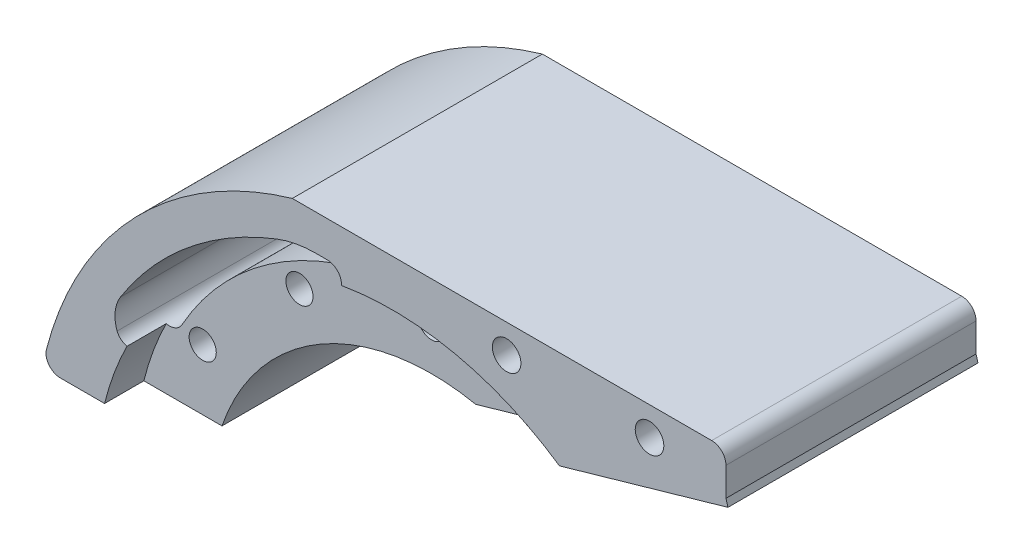
ISO-10303-21;
HEADER;
FILE_DESCRIPTION(('STEP AP214'),'2;1');
FILE_NAME('part.step','',(''),(''),'','','');
FILE_SCHEMA(('AUTOMOTIVE_DESIGN { 1 0 10303 214 1 1 1 1 }'));
ENDSEC;
DATA;
#1=APPLICATION_CONTEXT('core data for automotive mechanical design processes');
#2=APPLICATION_PROTOCOL_DEFINITION('international standard','automotive_design',2000,#1);
#3=PRODUCT_CONTEXT('',#1,'mechanical');
#4=PRODUCT('Part','Part','',(#3));
#5=PRODUCT_RELATED_PRODUCT_CATEGORY('part','',(#4));
#6=PRODUCT_DEFINITION_FORMATION('','',#4);
#7=PRODUCT_DEFINITION_CONTEXT('part definition',#1,'design');
#8=PRODUCT_DEFINITION('design','',#6,#7);
#9=PRODUCT_DEFINITION_SHAPE('','',#8);
#10=(LENGTH_UNIT() NAMED_UNIT(*) SI_UNIT(.MILLI.,.METRE.));
#11=(NAMED_UNIT(*) PLANE_ANGLE_UNIT() SI_UNIT($,.RADIAN.));
#12=(NAMED_UNIT(*) SI_UNIT($,.STERADIAN.) SOLID_ANGLE_UNIT());
#13=UNCERTAINTY_MEASURE_WITH_UNIT(LENGTH_MEASURE(1.E-05),#10,'distance_accuracy_value','');
#14=(GEOMETRIC_REPRESENTATION_CONTEXT(3) GLOBAL_UNCERTAINTY_ASSIGNED_CONTEXT((#13)) GLOBAL_UNIT_ASSIGNED_CONTEXT((#10,
#11,#12)) REPRESENTATION_CONTEXT('',''));
#15=CARTESIAN_POINT('',(0.,0.,0.));
#16=DIRECTION('',(0.,0.,1.));
#17=DIRECTION('',(1.,0.,0.));
#18=AXIS2_PLACEMENT_3D('',#15,#16,#17);
#19=CARTESIAN_POINT('',(46.4199727150327,26.4346966383038,35.));
#20=DIRECTION('',(-0.275637355816993,0.961261695938321,0.));
#21=DIRECTION('',(-0.961261695938321,-0.275637355816993,0.));
#22=AXIS2_PLACEMENT_3D('',#19,#20,#21);
#23=PLANE('',#22);
#24=DIRECTION('',(0.961261695938321,0.275637355816991,0.));
#25=VECTOR('',#24,1.);
#26=CARTESIAN_POINT('',(60.1747509336742,30.3788158246349,29.5));
#27=LINE('',#26,#25);
#28=CARTESIAN_POINT('',(60.1747509336742,30.3788158246349,29.5));
#29=VERTEX_POINT('',#28);
#30=CARTESIAN_POINT('',(67.0584771235376,32.3526925464053,29.5));
#31=VERTEX_POINT('',#30);
#32=EDGE_CURVE('E201',#29,#31,#27,.T.);
#33=ORIENTED_EDGE('',*,*,#32,.F.);
#34=DIRECTION('',(0.,0.,-1.));
#35=VECTOR('',#34,1.);
#36=CARTESIAN_POINT('',(60.1747509336742,30.3788158246349,35.));
#37=LINE('',#36,#35);
#38=CARTESIAN_POINT('',(60.1747509336742,30.3788158246349,0.));
#39=VERTEX_POINT('',#38);
#40=EDGE_CURVE('E197',#29,#39,#37,.T.);
#41=ORIENTED_EDGE('',*,*,#40,.T.);
#42=DIRECTION('',(0.961261695938321,0.275637355816991,0.));
#43=VECTOR('',#42,1.);
#44=CARTESIAN_POINT('',(67.0584771235376,32.3526925464053,0.));
#45=LINE('',#44,#43);
#46=CARTESIAN_POINT('',(67.0584771235376,32.3526925464053,0.));
#47=VERTEX_POINT('',#46);
#48=EDGE_CURVE('E200',#39,#47,#45,.T.);
#49=ORIENTED_EDGE('',*,*,#48,.T.);
#50=DIRECTION('',(0.,0.,1.));
#51=VECTOR('',#50,1.);
#52=CARTESIAN_POINT('',(67.0584771235376,32.3526925464053,-35.5400386676256));
#53=LINE('',#52,#51);
#54=EDGE_CURVE('E364',#47,#31,#53,.T.);
#55=ORIENTED_EDGE('',*,*,#54,.T.);
#56=EDGE_LOOP('',(#33,#41,#49,#55));
#57=FACE_BOUND('',#56,.T.);
#58=ADVANCED_FACE('F45',(#57),#23,.F.);
#59=CARTESIAN_POINT('',(21.9570600599758,18.5,35.));
#60=DIRECTION('',(0.,0.,-1.));
#61=DIRECTION('',(-1.,0.,0.));
#62=AXIS2_PLACEMENT_3D('',#59,#60,#61);
#63=CYLINDRICAL_SURFACE('',#62,1.9);
#64=CARTESIAN_POINT('',(21.9570600599758,18.5,29.5));
#65=DIRECTION('',(0.,0.,1.));
#66=DIRECTION('',(1.,0.,0.));
#67=AXIS2_PLACEMENT_3D('',#64,#65,#66);
#68=CIRCLE('',#67,1.9);
#69=CARTESIAN_POINT('',(23.8570600599758,18.5,29.5));
#70=VERTEX_POINT('',#69);
#71=EDGE_CURVE('E300',#70,#70,#68,.T.);
#72=ORIENTED_EDGE('',*,*,#71,.T.);
#73=EDGE_LOOP('',(#72));
#74=FACE_BOUND('',#73,.T.);
#75=CARTESIAN_POINT('',(21.9570600599758,18.5,0.));
#76=DIRECTION('',(0.,0.,1.));
#77=DIRECTION('',(1.,0.,0.));
#78=AXIS2_PLACEMENT_3D('',#75,#76,#77);
#79=CIRCLE('',#78,1.9);
#80=CARTESIAN_POINT('',(23.8570600599758,18.5,0.));
#81=VERTEX_POINT('',#80);
#82=EDGE_CURVE('E226',#81,#81,#79,.T.);
#83=ORIENTED_EDGE('',*,*,#82,.F.);
#84=EDGE_LOOP('',(#83));
#85=FACE_BOUND('',#84,.T.);
#86=ADVANCED_FACE('F521',(#74,#85),#63,.F.);
#87=CARTESIAN_POINT('',(35.5,32.0429399400242,35.));
#88=DIRECTION('',(0.,0.,-1.));
#89=DIRECTION('',(-1.,0.,0.));
#90=AXIS2_PLACEMENT_3D('',#87,#88,#89);
#91=CYLINDRICAL_SURFACE('',#90,1.90000000000001);
#92=CARTESIAN_POINT('',(35.5,32.0429399400242,29.5));
#93=DIRECTION('',(0.,0.,1.));
#94=DIRECTION('',(1.,0.,0.));
#95=AXIS2_PLACEMENT_3D('',#92,#93,#94);
#96=CIRCLE('',#95,1.90000000000001);
#97=CARTESIAN_POINT('',(37.4,32.0429399400242,29.5));
#98=VERTEX_POINT('',#97);
#99=EDGE_CURVE('E296',#98,#98,#96,.T.);
#100=ORIENTED_EDGE('',*,*,#99,.T.);
#101=EDGE_LOOP('',(#100));
#102=FACE_BOUND('',#101,.T.);
#103=CARTESIAN_POINT('',(35.5,32.0429399400242,0.));
#104=DIRECTION('',(0.,0.,1.));
#105=DIRECTION('',(1.,0.,0.));
#106=AXIS2_PLACEMENT_3D('',#103,#104,#105);
#107=CIRCLE('',#106,1.90000000000001);
#108=CARTESIAN_POINT('',(37.4,32.0429399400242,0.));
#109=VERTEX_POINT('',#108);
#110=EDGE_CURVE('E235',#109,#109,#107,.T.);
#111=ORIENTED_EDGE('',*,*,#110,.F.);
#112=EDGE_LOOP('',(#111));
#113=FACE_BOUND('',#112,.T.);
#114=ADVANCED_FACE('F527',(#102,#113),#91,.F.);
#115=CARTESIAN_POINT('',(54.,37.,35.));
#116=DIRECTION('',(0.,0.,-1.));
#117=DIRECTION('',(-1.,0.,0.));
#118=AXIS2_PLACEMENT_3D('',#115,#116,#117);
#119=CYLINDRICAL_SURFACE('',#118,1.9);
#120=CARTESIAN_POINT('',(54.,37.,29.5));
#121=DIRECTION('',(0.,0.,1.));
#122=DIRECTION('',(1.,0.,0.));
#123=AXIS2_PLACEMENT_3D('',#120,#121,#122);
#124=CIRCLE('',#123,1.9);
#125=CARTESIAN_POINT('',(55.9,37.,29.5));
#126=VERTEX_POINT('',#125);
#127=EDGE_CURVE('E283',#126,#126,#124,.T.);
#128=ORIENTED_EDGE('',*,*,#127,.T.);
#129=EDGE_LOOP('',(#128));
#130=FACE_BOUND('',#129,.T.);
#131=CARTESIAN_POINT('',(54.,37.,0.));
#132=DIRECTION('',(0.,0.,1.));
#133=DIRECTION('',(1.,0.,0.));
#134=AXIS2_PLACEMENT_3D('',#131,#132,#133);
#135=CIRCLE('',#134,1.9);
#136=CARTESIAN_POINT('',(55.9,37.,0.));
#137=VERTEX_POINT('',#136);
#138=EDGE_CURVE('E230',#137,#137,#135,.T.);
#139=ORIENTED_EDGE('',*,*,#138,.F.);
#140=EDGE_LOOP('',(#139));
#141=FACE_BOUND('',#140,.T.);
#142=ADVANCED_FACE('F604',(#130,#141),#119,.F.);
#143=CARTESIAN_POINT('',(67.3341144793546,31.3914308504669,-35.5400386676256));
#144=DIRECTION('',(-0.961261695938323,-0.275637355816985,0.));
#145=DIRECTION('',(0.275637355816985,-0.961261695938323,0.));
#146=AXIS2_PLACEMENT_3D('',#143,#144,#145);
#147=PLANE('',#146);
#148=DIRECTION('',(0.,0.,1.));
#149=VECTOR('',#148,1.);
#150=CARTESIAN_POINT('',(67.3341144793546,31.3914308504669,-35.5400386676256));
#151=LINE('',#150,#149);
#152=CARTESIAN_POINT('',(67.3341144793546,31.3914308504669,0.));
#153=VERTEX_POINT('',#152);
#154=CARTESIAN_POINT('',(67.3341144793546,31.3914308504669,29.5));
#155=VERTEX_POINT('',#154);
#156=EDGE_CURVE('E371',#153,#155,#151,.T.);
#157=ORIENTED_EDGE('',*,*,#156,.T.);
#158=DIRECTION('',(0.275637355816985,-0.961261695938323,0.));
#159=VECTOR('',#158,1.);
#160=CARTESIAN_POINT('',(67.0584771235376,32.3526925464053,29.5));
#161=LINE('',#160,#159);
#162=EDGE_CURVE('E242',#31,#155,#161,.T.);
#163=ORIENTED_EDGE('',*,*,#162,.F.);
#164=ORIENTED_EDGE('',*,*,#54,.F.);
#165=DIRECTION('',(0.275637355816985,-0.961261695938323,0.));
#166=VECTOR('',#165,1.);
#167=CARTESIAN_POINT('',(67.3341144793546,31.3914308504669,0.));
#168=LINE('',#167,#166);
#169=EDGE_CURVE('E215',#47,#153,#168,.T.);
#170=ORIENTED_EDGE('',*,*,#169,.T.);
#171=EDGE_LOOP('',(#157,#163,#164,#170));
#172=FACE_BOUND('',#171,.T.);
#173=ADVANCED_FACE('F502',(#172),#147,.T.);
#174=CARTESIAN_POINT('',(54.,0.,0.));
#175=DIRECTION('',(0.,0.,1.));
#176=DIRECTION('',(1.,0.,0.));
#177=AXIS2_PLACEMENT_3D('',#174,#175,#176);
#178=CYLINDRICAL_SURFACE('',#177,40.);
#179=CARTESIAN_POINT('',(54.,0.,29.5));
#180=DIRECTION('',(0.,0.,1.));
#181=DIRECTION('',(1.,0.,0.));
#182=AXIS2_PLACEMENT_3D('',#179,#180,#181);
#183=CIRCLE('',#182,40.);
#184=CARTESIAN_POINT('',(45.3233965912911,39.047619047619,29.5));
#185=VERTEX_POINT('',#184);
#186=CARTESIAN_POINT('',(19.0609266203707,19.4746284014066,29.5));
#187=VERTEX_POINT('',#186);
#188=EDGE_CURVE('E257',#185,#187,#183,.T.);
#189=ORIENTED_EDGE('',*,*,#188,.F.);
#190=DIRECTION('',(0.,0.,1.));
#191=VECTOR('',#190,1.);
#192=CARTESIAN_POINT('',(45.3233965912911,39.0476190476191,0.));
#193=LINE('',#192,#191);
#194=CARTESIAN_POINT('',(45.3233965912911,39.047619047619,0.));
#195=VERTEX_POINT('',#194);
#196=EDGE_CURVE('E345',#195,#185,#193,.T.);
#197=ORIENTED_EDGE('',*,*,#196,.F.);
#198=CARTESIAN_POINT('',(54.,0.,0.));
#199=DIRECTION('',(0.,0.,1.));
#200=DIRECTION('',(1.,0.,0.));
#201=AXIS2_PLACEMENT_3D('',#198,#199,#200);
#202=CIRCLE('',#201,40.);
#203=CARTESIAN_POINT('',(19.0609266203707,19.4746284014067,0.));
#204=VERTEX_POINT('',#203);
#205=EDGE_CURVE('E222',#195,#204,#202,.T.);
#206=ORIENTED_EDGE('',*,*,#205,.T.);
#207=DIRECTION('',(0.,0.,1.));
#208=VECTOR('',#207,1.);
#209=CARTESIAN_POINT('',(19.0609266203706,19.4746284014067,0.));
#210=LINE('',#209,#208);
#211=EDGE_CURVE('E350',#204,#187,#210,.T.);
#212=ORIENTED_EDGE('',*,*,#211,.T.);
#213=EDGE_LOOP('',(#189,#197,#206,#212));
#214=FACE_BOUND('',#213,.T.);
#215=ADVANCED_FACE('F563',(#214),#178,.T.);
#216=CARTESIAN_POINT('',(54.,0.,35.));
#217=DIRECTION('',(0.,0.,-1.));
#218=DIRECTION('',(-1.,0.,0.));
#219=AXIS2_PLACEMENT_3D('',#216,#217,#218);
#220=CYLINDRICAL_SURFACE('',#219,31.);
#221=CARTESIAN_POINT('',(54.,0.,29.5));
#222=DIRECTION('',(0.,0.,-1.));
#223=DIRECTION('',(1.,0.,0.));
#224=AXIS2_PLACEMENT_3D('',#221,#222,#223);
#225=CIRCLE('',#224,31.);
#226=CARTESIAN_POINT('',(24.6571984977576,10.,29.5));
#227=VERTEX_POINT('',#226);
#228=EDGE_CURVE('E269',#227,#29,#225,.T.);
#229=ORIENTED_EDGE('',*,*,#228,.F.);
#230=DIRECTION('',(0.,0.,-1.));
#231=VECTOR('',#230,1.);
#232=CARTESIAN_POINT('',(24.6571984977576,10.,35.));
#233=LINE('',#232,#231);
#234=CARTESIAN_POINT('',(24.6571984977576,10.,0.));
#235=VERTEX_POINT('',#234);
#236=EDGE_CURVE('E205',#235,#227,#233,.F.);
#237=ORIENTED_EDGE('',*,*,#236,.F.);
#238=CARTESIAN_POINT('',(54.,0.,0.));
#239=DIRECTION('',(0.,0.,1.));
#240=DIRECTION('',(1.,0.,0.));
#241=AXIS2_PLACEMENT_3D('',#238,#239,#240);
#242=CIRCLE('',#241,31.);
#243=EDGE_CURVE('E213',#235,#39,#242,.F.);
#244=ORIENTED_EDGE('',*,*,#243,.T.);
#245=ORIENTED_EDGE('',*,*,#40,.F.);
#246=EDGE_LOOP('',(#229,#237,#244,#245));
#247=FACE_BOUND('',#246,.T.);
#248=ADVANCED_FACE('F219',(#247),#220,.F.);
#249=CARTESIAN_POINT('',(44.8895664208557,43.,0.));
#250=DIRECTION('',(0.,1.,0.));
#251=DIRECTION('',(-1.,0.,0.));
#252=AXIS2_PLACEMENT_3D('',#249,#250,#251);
#253=PLANE('',#252);
#254=DIRECTION('',(-1.,0.,0.));
#255=VECTOR('',#254,1.);
#256=CARTESIAN_POINT('',(44.8895664208557,43.,35.));
#257=LINE('',#256,#255);
#258=CARTESIAN_POINT('',(44.8895664208557,43.,35.));
#259=VERTEX_POINT('',#258);
#260=CARTESIAN_POINT('',(43.2296703857309,43.,35.));
#261=VERTEX_POINT('',#260);
#262=EDGE_CURVE('E338',#259,#261,#257,.T.);
#263=ORIENTED_EDGE('',*,*,#262,.T.);
#264=DIRECTION('',(0.,0.,1.));
#265=VECTOR('',#264,1.);
#266=CARTESIAN_POINT('',(43.2296703857309,43.,0.));
#267=LINE('',#266,#265);
#268=CARTESIAN_POINT('',(43.2296703857309,43.,0.));
#269=VERTEX_POINT('',#268);
#270=EDGE_CURVE('E423',#261,#269,#267,.F.);
#271=ORIENTED_EDGE('',*,*,#270,.T.);
#272=DIRECTION('',(-1.,0.,0.));
#273=VECTOR('',#272,1.);
#274=CARTESIAN_POINT('',(44.8895664208557,43.,0.));
#275=LINE('',#274,#273);
#276=CARTESIAN_POINT('',(44.8895664208557,43.,0.));
#277=VERTEX_POINT('',#276);
#278=EDGE_CURVE('E327',#277,#269,#275,.T.);
#279=ORIENTED_EDGE('',*,*,#278,.F.);
#280=DIRECTION('',(0.,0.,1.));
#281=VECTOR('',#280,1.);
#282=CARTESIAN_POINT('',(44.8895664208557,43.,0.));
#283=LINE('',#282,#281);
#284=EDGE_CURVE('E335',#277,#259,#283,.T.);
#285=ORIENTED_EDGE('',*,*,#284,.T.);
#286=EDGE_LOOP('',(#263,#271,#279,#285));
#287=FACE_BOUND('',#286,.T.);
#288=ADVANCED_FACE('F550',(#287),#253,.F.);
#289=CARTESIAN_POINT('',(-54.,0.,35.));
#290=DIRECTION('',(0.,0.,1.));
#291=DIRECTION('',(1.,0.,0.));
#292=AXIS2_PLACEMENT_3D('',#289,#290,#291);
#293=PLANE('',#292);
#294=CARTESIAN_POINT('',(54.,0.,35.));
#295=DIRECTION('',(0.,0.,1.));
#296=DIRECTION('',(1.,0.,0.));
#297=AXIS2_PLACEMENT_3D('',#294,#295,#296);
#298=CIRCLE('',#297,41.5);
#299=CARTESIAN_POINT('',(16.8527753249302,18.5022619952234,35.));
#300=VERTEX_POINT('',#299);
#301=CARTESIAN_POINT('',(13.7228352537073,10.,35.));
#302=VERTEX_POINT('',#301);
#303=EDGE_CURVE('E246',#300,#302,#298,.T.);
#304=ORIENTED_EDGE('',*,*,#303,.F.);
#305=CARTESIAN_POINT('',(17.3139729513892,20.448359821477,35.));
#306=DIRECTION('',(0.,0.,1.));
#307=DIRECTION('',(-1.,0.,0.));
#308=AXIS2_PLACEMENT_3D('',#305,#306,#307);
#309=CIRCLE('',#308,2.);
#310=CARTESIAN_POINT('',(15.4765568822514,19.6584850283139,35.));
#311=VERTEX_POINT('',#310);
#312=EDGE_CURVE('E328',#311,#300,#309,.T.);
#313=ORIENTED_EDGE('',*,*,#312,.F.);
#314=CARTESIAN_POINT('',(20.1790408058632,21.3574979618058,35.));
#315=DIRECTION('',(0.,0.,1.));
#316=DIRECTION('',(1.,0.,0.));
#317=AXIS2_PLACEMENT_3D('',#314,#315,#316);
#318=CIRCLE('',#317,5.);
#319=CARTESIAN_POINT('',(15.9514209065961,24.0271852070315,35.));
#320=VERTEX_POINT('',#319);
#321=EDGE_CURVE('E445',#311,#320,#318,.F.);
#322=ORIENTED_EDGE('',*,*,#321,.T.);
#323=CARTESIAN_POINT('',(54.,0.,35.));
#324=DIRECTION('',(0.,0.,1.));
#325=DIRECTION('',(1.,0.,0.));
#326=AXIS2_PLACEMENT_3D('',#323,#324,#325);
#327=CIRCLE('',#326,45.);
#328=CARTESIAN_POINT('',(37.8445055785964,42.,35.));
#329=VERTEX_POINT('',#328);
#330=EDGE_CURVE('E307',#320,#329,#327,.F.);
#331=ORIENTED_EDGE('',*,*,#330,.T.);
#332=CARTESIAN_POINT('',(43.2296703857309,28.,35.));
#333=DIRECTION('',(0.,0.,1.));
#334=DIRECTION('',(1.,0.,0.));
#335=AXIS2_PLACEMENT_3D('',#332,#333,#334);
#336=CIRCLE('',#335,15.);
#337=EDGE_CURVE('E435',#329,#261,#336,.F.);
#338=ORIENTED_EDGE('',*,*,#337,.T.);
#339=ORIENTED_EDGE('',*,*,#262,.F.);
#340=CARTESIAN_POINT('',(44.8895664208557,41.,35.));
#341=DIRECTION('',(0.,0.,1.));
#342=DIRECTION('',(1.,0.,0.));
#343=AXIS2_PLACEMENT_3D('',#340,#341,#342);
#344=CIRCLE('',#343,2.);
#345=CARTESIAN_POINT('',(46.8863010018895,40.8857589701388,35.));
#346=VERTEX_POINT('',#345);
#347=EDGE_CURVE('E323',#346,#259,#344,.T.);
#348=ORIENTED_EDGE('',*,*,#347,.F.);
#349=CARTESIAN_POINT('',(54.,0.,35.));
#350=DIRECTION('',(0.,0.,1.));
#351=DIRECTION('',(1.,0.,0.));
#352=AXIS2_PLACEMENT_3D('',#349,#350,#351);
#353=CIRCLE('',#352,41.5);
#354=CARTESIAN_POINT('',(77.3958466992501,34.2765861372627,35.));
#355=VERTEX_POINT('',#354);
#356=EDGE_CURVE('E234',#355,#346,#353,.T.);
#357=ORIENTED_EDGE('',*,*,#356,.F.);
#358=DIRECTION('',(0.961261695938321,0.275637355816992,0.));
#359=VECTOR('',#358,1.);
#360=CARTESIAN_POINT('',(100.978273837196,41.0387383040617,35.));
#361=LINE('',#360,#359);
#362=CARTESIAN_POINT('',(100.978273837196,41.0387383040617,35.));
#363=VERTEX_POINT('',#362);
#364=EDGE_CURVE('E349',#355,#363,#361,.T.);
#365=ORIENTED_EDGE('',*,*,#364,.T.);
#366=DIRECTION('',(-0.275637355816996,0.96126169593832,0.));
#367=VECTOR('',#366,1.);
#368=CARTESIAN_POINT('',(100.702636481379,42.,35.));
#369=LINE('',#368,#367);
#370=CARTESIAN_POINT('',(100.702636481379,42.,35.));
#371=VERTEX_POINT('',#370);
#372=EDGE_CURVE('E367',#363,#371,#369,.T.);
#373=ORIENTED_EDGE('',*,*,#372,.T.);
#374=DIRECTION('',(0.,1.,0.));
#375=VECTOR('',#374,1.);
#376=CARTESIAN_POINT('',(100.702636481379,48.,35.));
#377=LINE('',#376,#375);
#378=CARTESIAN_POINT('',(100.702636481379,46.,35.));
#379=VERTEX_POINT('',#378);
#380=EDGE_CURVE('E404',#371,#379,#377,.T.);
#381=ORIENTED_EDGE('',*,*,#380,.T.);
#382=CARTESIAN_POINT('',(98.7026364813788,46.,35.));
#383=DIRECTION('',(0.,0.,1.));
#384=DIRECTION('',(1.,0.,0.));
#385=AXIS2_PLACEMENT_3D('',#382,#383,#384);
#386=CIRCLE('',#385,2.);
#387=CARTESIAN_POINT('',(98.7026364813788,48.,35.));
#388=VERTEX_POINT('',#387);
#389=EDGE_CURVE('E452',#379,#388,#386,.T.);
#390=ORIENTED_EDGE('',*,*,#389,.T.);
#391=DIRECTION('',(-1.,0.,0.));
#392=VECTOR('',#391,1.);
#393=CARTESIAN_POINT('',(-100.702636481379,48.,35.));
#394=LINE('',#393,#392);
#395=CARTESIAN_POINT('',(39.9999999999999,48.,35.));
#396=VERTEX_POINT('',#395);
#397=EDGE_CURVE('E409',#388,#396,#394,.T.);
#398=ORIENTED_EDGE('',*,*,#397,.T.);
#399=CARTESIAN_POINT('',(54.,0.,35.));
#400=DIRECTION('',(0.,0.,1.));
#401=DIRECTION('',(1.,0.,0.));
#402=AXIS2_PLACEMENT_3D('',#399,#400,#401);
#403=CIRCLE('',#402,50.);
#404=CARTESIAN_POINT('',(5.58770817240727,12.5,35.));
#405=VERTEX_POINT('',#404);
#406=EDGE_CURVE('E206',#396,#405,#403,.T.);
#407=ORIENTED_EDGE('',*,*,#406,.T.);
#408=CARTESIAN_POINT('',(7.524199845511,12.,35.));
#409=DIRECTION('',(0.,0.,1.));
#410=DIRECTION('',(1.,0.,0.));
#411=AXIS2_PLACEMENT_3D('',#408,#409,#410);
#412=CIRCLE('',#411,2.);
#413=CARTESIAN_POINT('',(7.52419984551099,10.,35.));
#414=VERTEX_POINT('',#413);
#415=EDGE_CURVE('E455',#405,#414,#412,.T.);
#416=ORIENTED_EDGE('',*,*,#415,.T.);
#417=DIRECTION('',(1.,0.,0.));
#418=VECTOR('',#417,1.);
#419=CARTESIAN_POINT('',(-28.382623085101,10.,35.));
#420=LINE('',#419,#418);
#421=EDGE_CURVE('E400',#414,#302,#420,.T.);
#422=ORIENTED_EDGE('',*,*,#421,.T.);
#423=EDGE_LOOP('',(#304,#313,#322,#331,#338,#339,#348,#357,#365,#373,#381,#390,#398,#407,#416,#422));
#424=FACE_BOUND('',#423,.T.);
#425=CARTESIAN_POINT('',(70.,44.,35.));
#426=DIRECTION('',(0.,0.,1.));
#427=DIRECTION('',(-1.,0.,0.));
#428=AXIS2_PLACEMENT_3D('',#425,#426,#427);
#429=CIRCLE('',#428,2.);
#430=CARTESIAN_POINT('',(68.,44.,35.));
#431=VERTEX_POINT('',#430);
#432=EDGE_CURVE('E392',#431,#431,#429,.T.);
#433=ORIENTED_EDGE('',*,*,#432,.F.);
#434=EDGE_LOOP('',(#433));
#435=FACE_BOUND('',#434,.T.);
#436=CARTESIAN_POINT('',(90.,44.,35.));
#437=DIRECTION('',(0.,0.,1.));
#438=DIRECTION('',(-1.,0.,0.));
#439=AXIS2_PLACEMENT_3D('',#436,#437,#438);
#440=CIRCLE('',#439,2.);
#441=CARTESIAN_POINT('',(88.,44.,35.));
#442=VERTEX_POINT('',#441);
#443=EDGE_CURVE('E384',#442,#442,#440,.T.);
#444=ORIENTED_EDGE('',*,*,#443,.F.);
#445=EDGE_LOOP('',(#444));
#446=FACE_BOUND('',#445,.T.);
#447=ADVANCED_FACE('F482',(#424,#435,#446),#293,.T.);
#448=CARTESIAN_POINT('',(-54.,0.,0.));
#449=DIRECTION('',(0.,0.,1.));
#450=DIRECTION('',(1.,0.,0.));
#451=AXIS2_PLACEMENT_3D('',#448,#449,#450);
#452=PLANE('',#451);
#453=CARTESIAN_POINT('',(17.3139729513892,20.448359821477,0.));
#454=DIRECTION('',(0.,0.,1.));
#455=DIRECTION('',(-1.,0.,0.));
#456=AXIS2_PLACEMENT_3D('',#453,#454,#455);
#457=CIRCLE('',#456,2.);
#458=CARTESIAN_POINT('',(15.4765568822514,19.6584850283139,0.));
#459=VERTEX_POINT('',#458);
#460=EDGE_CURVE('E332',#459,#204,#457,.T.);
#461=ORIENTED_EDGE('',*,*,#460,.T.);
#462=ORIENTED_EDGE('',*,*,#205,.F.);
#463=CARTESIAN_POINT('',(44.8895664208557,41.,0.));
#464=DIRECTION('',(0.,0.,1.));
#465=DIRECTION('',(1.,0.,0.));
#466=AXIS2_PLACEMENT_3D('',#463,#464,#465);
#467=CIRCLE('',#466,2.);
#468=EDGE_CURVE('E324',#195,#277,#467,.T.);
#469=ORIENTED_EDGE('',*,*,#468,.T.);
#470=ORIENTED_EDGE('',*,*,#278,.T.);
#471=CARTESIAN_POINT('',(43.2296703857309,28.,0.));
#472=DIRECTION('',(0.,0.,1.));
#473=DIRECTION('',(1.,0.,0.));
#474=AXIS2_PLACEMENT_3D('',#471,#472,#473);
#475=CIRCLE('',#474,15.);
#476=CARTESIAN_POINT('',(37.8445055785964,42.,0.));
#477=VERTEX_POINT('',#476);
#478=EDGE_CURVE('E431',#269,#477,#475,.T.);
#479=ORIENTED_EDGE('',*,*,#478,.T.);
#480=CARTESIAN_POINT('',(54.,0.,0.));
#481=DIRECTION('',(0.,0.,-1.));
#482=DIRECTION('',(-1.,0.,0.));
#483=AXIS2_PLACEMENT_3D('',#480,#481,#482);
#484=CIRCLE('',#483,45.);
#485=CARTESIAN_POINT('',(15.9514209065961,24.0271852070315,0.));
#486=VERTEX_POINT('',#485);
#487=EDGE_CURVE('E304',#486,#477,#484,.T.);
#488=ORIENTED_EDGE('',*,*,#487,.F.);
#489=CARTESIAN_POINT('',(20.1790408058632,21.3574979618058,0.));
#490=DIRECTION('',(0.,0.,1.));
#491=DIRECTION('',(1.,0.,0.));
#492=AXIS2_PLACEMENT_3D('',#489,#490,#491);
#493=CIRCLE('',#492,5.);
#494=EDGE_CURVE('E442',#486,#459,#493,.T.);
#495=ORIENTED_EDGE('',*,*,#494,.T.);
#496=EDGE_LOOP('',(#461,#462,#469,#470,#479,#488,#495));
#497=FACE_BOUND('',#496,.T.);
#498=DIRECTION('',(1.,0.,0.));
#499=VECTOR('',#498,1.);
#500=CARTESIAN_POINT('',(-28.382623085101,10.,0.));
#501=LINE('',#500,#499);
#502=CARTESIAN_POINT('',(7.52419984551099,10.,0.));
#503=VERTEX_POINT('',#502);
#504=EDGE_CURVE('E396',#503,#235,#501,.T.);
#505=ORIENTED_EDGE('',*,*,#504,.F.);
#506=CARTESIAN_POINT('',(7.524199845511,12.,0.));
#507=DIRECTION('',(0.,0.,1.));
#508=DIRECTION('',(1.,0.,0.));
#509=AXIS2_PLACEMENT_3D('',#506,#507,#508);
#510=CIRCLE('',#509,2.);
#511=CARTESIAN_POINT('',(5.58770817240727,12.5,0.));
#512=VERTEX_POINT('',#511);
#513=EDGE_CURVE('E463',#503,#512,#510,.F.);
#514=ORIENTED_EDGE('',*,*,#513,.T.);
#515=CARTESIAN_POINT('',(54.,0.,0.));
#516=DIRECTION('',(0.,0.,-1.));
#517=DIRECTION('',(-1.,0.,0.));
#518=AXIS2_PLACEMENT_3D('',#515,#516,#517);
#519=CIRCLE('',#518,50.);
#520=CARTESIAN_POINT('',(39.9999999999999,48.,0.));
#521=VERTEX_POINT('',#520);
#522=EDGE_CURVE('E310',#512,#521,#519,.T.);
#523=ORIENTED_EDGE('',*,*,#522,.T.);
#524=DIRECTION('',(-1.,0.,0.));
#525=VECTOR('',#524,1.);
#526=CARTESIAN_POINT('',(-100.702636481379,48.,0.));
#527=LINE('',#526,#525);
#528=CARTESIAN_POINT('',(98.7026364813788,48.,0.));
#529=VERTEX_POINT('',#528);
#530=EDGE_CURVE('E405',#529,#521,#527,.T.);
#531=ORIENTED_EDGE('',*,*,#530,.F.);
#532=CARTESIAN_POINT('',(98.7026364813788,46.,0.));
#533=DIRECTION('',(0.,0.,1.));
#534=DIRECTION('',(1.,0.,0.));
#535=AXIS2_PLACEMENT_3D('',#532,#533,#534);
#536=CIRCLE('',#535,2.);
#537=CARTESIAN_POINT('',(100.702636481379,46.,0.));
#538=VERTEX_POINT('',#537);
#539=EDGE_CURVE('E69',#529,#538,#536,.F.);
#540=ORIENTED_EDGE('',*,*,#539,.T.);
#541=DIRECTION('',(0.,1.,0.));
#542=VECTOR('',#541,1.);
#543=CARTESIAN_POINT('',(100.702636481379,48.,0.));
#544=LINE('',#543,#542);
#545=CARTESIAN_POINT('',(100.702636481379,42.,0.));
#546=VERTEX_POINT('',#545);
#547=EDGE_CURVE('E415',#546,#538,#544,.T.);
#548=ORIENTED_EDGE('',*,*,#547,.F.);
#549=DIRECTION('',(0.275637355816996,-0.96126169593832,0.));
#550=VECTOR('',#549,1.);
#551=CARTESIAN_POINT('',(100.702636481379,42.,0.));
#552=LINE('',#551,#550);
#553=CARTESIAN_POINT('',(100.978273837196,41.0387383040617,0.));
#554=VERTEX_POINT('',#553);
#555=EDGE_CURVE('E360',#546,#554,#552,.T.);
#556=ORIENTED_EDGE('',*,*,#555,.T.);
#557=DIRECTION('',(-0.961261695938321,-0.275637355816992,0.));
#558=VECTOR('',#557,1.);
#559=CARTESIAN_POINT('',(100.978273837196,41.0387383040617,0.));
#560=LINE('',#559,#558);
#561=EDGE_CURVE('E363',#554,#153,#560,.T.);
#562=ORIENTED_EDGE('',*,*,#561,.T.);
#563=ORIENTED_EDGE('',*,*,#169,.F.);
#564=ORIENTED_EDGE('',*,*,#48,.F.);
#565=ORIENTED_EDGE('',*,*,#243,.F.);
#566=EDGE_LOOP('',(#505,#514,#523,#531,#540,#548,#556,#562,#563,#564,#565));
#567=FACE_BOUND('',#566,.T.);
#568=CARTESIAN_POINT('',(90.,44.,0.));
#569=DIRECTION('',(0.,0.,1.));
#570=DIRECTION('',(-1.,0.,0.));
#571=AXIS2_PLACEMENT_3D('',#568,#569,#570);
#572=CIRCLE('',#571,2.);
#573=CARTESIAN_POINT('',(88.,44.,0.));
#574=VERTEX_POINT('',#573);
#575=EDGE_CURVE('E383',#574,#574,#572,.T.);
#576=ORIENTED_EDGE('',*,*,#575,.T.);
#577=EDGE_LOOP('',(#576));
#578=FACE_BOUND('',#577,.T.);
#579=CARTESIAN_POINT('',(70.,44.,0.));
#580=DIRECTION('',(0.,0.,1.));
#581=DIRECTION('',(-1.,0.,0.));
#582=AXIS2_PLACEMENT_3D('',#579,#580,#581);
#583=CIRCLE('',#582,2.);
#584=CARTESIAN_POINT('',(68.,44.,0.));
#585=VERTEX_POINT('',#584);
#586=EDGE_CURVE('E388',#585,#585,#583,.T.);
#587=ORIENTED_EDGE('',*,*,#586,.T.);
#588=EDGE_LOOP('',(#587));
#589=FACE_BOUND('',#588,.T.);
#590=ORIENTED_EDGE('',*,*,#82,.T.);
#591=EDGE_LOOP('',(#590));
#592=FACE_BOUND('',#591,.T.);
#593=ORIENTED_EDGE('',*,*,#110,.T.);
#594=EDGE_LOOP('',(#593));
#595=FACE_BOUND('',#594,.T.);
#596=ORIENTED_EDGE('',*,*,#138,.T.);
#597=EDGE_LOOP('',(#596));
#598=FACE_BOUND('',#597,.T.);
#599=ADVANCED_FACE('F211',(#497,#567,#578,#589,#592,#595,#598),#452,.F.);
#600=CARTESIAN_POINT('',(-28.382623085101,10.,35.));
#601=DIRECTION('',(0.,1.,0.));
#602=DIRECTION('',(0.,0.,1.));
#603=AXIS2_PLACEMENT_3D('',#600,#601,#602);
#604=PLANE('',#603);
#605=DIRECTION('',(1.,0.,0.));
#606=VECTOR('',#605,1.);
#607=CARTESIAN_POINT('',(13.7228352537073,10.,29.5));
#608=LINE('',#607,#606);
#609=CARTESIAN_POINT('',(13.7228352537073,10.,29.5));
#610=VERTEX_POINT('',#609);
#611=EDGE_CURVE('E61',#610,#227,#608,.T.);
#612=ORIENTED_EDGE('',*,*,#611,.F.);
#613=DIRECTION('',(0.,0.,1.));
#614=VECTOR('',#613,1.);
#615=CARTESIAN_POINT('',(13.7228352537073,10.,29.5));
#616=LINE('',#615,#614);
#617=EDGE_CURVE('E279',#610,#302,#616,.T.);
#618=ORIENTED_EDGE('',*,*,#617,.T.);
#619=ORIENTED_EDGE('',*,*,#421,.F.);
#620=DIRECTION('',(0.,0.,1.));
#621=VECTOR('',#620,1.);
#622=CARTESIAN_POINT('',(7.524199845511,10.,0.));
#623=LINE('',#622,#621);
#624=EDGE_CURVE('E458',#414,#503,#623,.F.);
#625=ORIENTED_EDGE('',*,*,#624,.T.);
#626=ORIENTED_EDGE('',*,*,#504,.T.);
#627=ORIENTED_EDGE('',*,*,#236,.T.);
#628=EDGE_LOOP('',(#612,#618,#619,#625,#626,#627));
#629=FACE_BOUND('',#628,.T.);
#630=ADVANCED_FACE('F506',(#629),#604,.F.);
#631=CARTESIAN_POINT('',(-100.702636481379,48.,35.));
#632=DIRECTION('',(0.,-1.,0.));
#633=DIRECTION('',(0.,0.,-1.));
#634=AXIS2_PLACEMENT_3D('',#631,#632,#633);
#635=PLANE('',#634);
#636=ORIENTED_EDGE('',*,*,#397,.F.);
#637=DIRECTION('',(0.,0.,-1.));
#638=VECTOR('',#637,1.);
#639=CARTESIAN_POINT('',(98.7026364813788,48.,35.));
#640=LINE('',#639,#638);
#641=EDGE_CURVE('E54',#388,#529,#640,.T.);
#642=ORIENTED_EDGE('',*,*,#641,.T.);
#643=ORIENTED_EDGE('',*,*,#530,.T.);
#644=DIRECTION('',(0.,0.,-1.));
#645=VECTOR('',#644,1.);
#646=CARTESIAN_POINT('',(39.9999999999999,48.,90.));
#647=LINE('',#646,#645);
#648=EDGE_CURVE('E314',#396,#521,#647,.T.);
#649=ORIENTED_EDGE('',*,*,#648,.F.);
#650=EDGE_LOOP('',(#636,#642,#643,#649));
#651=FACE_BOUND('',#650,.T.);
#652=ADVANCED_FACE('F470',(#651),#635,.F.);
#653=CARTESIAN_POINT('',(100.702636481379,48.,35.));
#654=DIRECTION('',(-1.,0.,0.));
#655=DIRECTION('',(0.,0.,1.));
#656=AXIS2_PLACEMENT_3D('',#653,#654,#655);
#657=PLANE('',#656);
#658=ORIENTED_EDGE('',*,*,#547,.T.);
#659=DIRECTION('',(0.,0.,-1.));
#660=VECTOR('',#659,1.);
#661=CARTESIAN_POINT('',(100.702636481379,46.,35.));
#662=LINE('',#661,#660);
#663=EDGE_CURVE('E11',#538,#379,#662,.F.);
#664=ORIENTED_EDGE('',*,*,#663,.T.);
#665=ORIENTED_EDGE('',*,*,#380,.F.);
#666=DIRECTION('',(0.,0.,-1.));
#667=VECTOR('',#666,1.);
#668=CARTESIAN_POINT('',(100.702636481379,42.,35.));
#669=LINE('',#668,#667);
#670=EDGE_CURVE('E412',#371,#546,#669,.T.);
#671=ORIENTED_EDGE('',*,*,#670,.T.);
#672=EDGE_LOOP('',(#658,#664,#665,#671));
#673=FACE_BOUND('',#672,.T.);
#674=ADVANCED_FACE('F488',(#673),#657,.F.);
#675=CARTESIAN_POINT('',(70.,44.,35.));
#676=DIRECTION('',(0.,0.,-1.));
#677=DIRECTION('',(-1.,0.,0.));
#678=AXIS2_PLACEMENT_3D('',#675,#676,#677);
#679=CYLINDRICAL_SURFACE('',#678,2.);
#680=ORIENTED_EDGE('',*,*,#432,.T.);
#681=EDGE_LOOP('',(#680));
#682=FACE_BOUND('',#681,.T.);
#683=ORIENTED_EDGE('',*,*,#586,.F.);
#684=EDGE_LOOP('',(#683));
#685=FACE_BOUND('',#684,.T.);
#686=ADVANCED_FACE('F607',(#682,#685),#679,.F.);
#687=CARTESIAN_POINT('',(90.,44.,35.));
#688=DIRECTION('',(0.,0.,-1.));
#689=DIRECTION('',(-1.,0.,0.));
#690=AXIS2_PLACEMENT_3D('',#687,#688,#689);
#691=CYLINDRICAL_SURFACE('',#690,2.);
#692=ORIENTED_EDGE('',*,*,#443,.T.);
#693=EDGE_LOOP('',(#692));
#694=FACE_BOUND('',#693,.T.);
#695=ORIENTED_EDGE('',*,*,#575,.F.);
#696=EDGE_LOOP('',(#695));
#697=FACE_BOUND('',#696,.T.);
#698=ADVANCED_FACE('F599',(#694,#697),#691,.F.);
#699=CARTESIAN_POINT('',(100.702636481379,42.,-35.5400386676256));
#700=DIRECTION('',(0.96126169593832,0.275637355816996,0.));
#701=DIRECTION('',(-0.275637355816996,0.96126169593832,0.));
#702=AXIS2_PLACEMENT_3D('',#699,#700,#701);
#703=PLANE('',#702);
#704=ORIENTED_EDGE('',*,*,#555,.F.);
#705=ORIENTED_EDGE('',*,*,#670,.F.);
#706=ORIENTED_EDGE('',*,*,#372,.F.);
#707=DIRECTION('',(0.,0.,1.));
#708=VECTOR('',#707,1.);
#709=CARTESIAN_POINT('',(100.978273837196,41.0387383040617,-35.5400386676256));
#710=LINE('',#709,#708);
#711=EDGE_CURVE('E374',#554,#363,#710,.T.);
#712=ORIENTED_EDGE('',*,*,#711,.F.);
#713=EDGE_LOOP('',(#704,#705,#706,#712));
#714=FACE_BOUND('',#713,.T.);
#715=ADVANCED_FACE('F494',(#714),#703,.T.);
#716=CARTESIAN_POINT('',(100.978273837196,41.0387383040617,-35.5400386676256));
#717=DIRECTION('',(0.275637355816992,-0.961261695938321,0.));
#718=DIRECTION('',(0.961261695938321,0.275637355816992,0.));
#719=AXIS2_PLACEMENT_3D('',#716,#717,#718);
#720=PLANE('',#719);
#721=DIRECTION('',(0.,0.,1.));
#722=VECTOR('',#721,1.);
#723=CARTESIAN_POINT('',(77.3958466992501,34.2765861372627,29.5));
#724=LINE('',#723,#722);
#725=CARTESIAN_POINT('',(77.3958466992501,34.2765861372627,29.5));
#726=VERTEX_POINT('',#725);
#727=EDGE_CURVE('E274',#726,#355,#724,.T.);
#728=ORIENTED_EDGE('',*,*,#727,.F.);
#729=DIRECTION('',(0.961261695938321,0.275637355816993,0.));
#730=VECTOR('',#729,1.);
#731=CARTESIAN_POINT('',(67.3341144793546,31.3914308504669,29.5));
#732=LINE('',#731,#730);
#733=EDGE_CURVE('E245',#155,#726,#732,.T.);
#734=ORIENTED_EDGE('',*,*,#733,.F.);
#735=ORIENTED_EDGE('',*,*,#156,.F.);
#736=ORIENTED_EDGE('',*,*,#561,.F.);
#737=ORIENTED_EDGE('',*,*,#711,.T.);
#738=ORIENTED_EDGE('',*,*,#364,.F.);
#739=EDGE_LOOP('',(#728,#734,#735,#736,#737,#738));
#740=FACE_BOUND('',#739,.T.);
#741=ADVANCED_FACE('F498',(#740),#720,.T.);
#742=CARTESIAN_POINT('',(44.8895664208557,41.,0.));
#743=DIRECTION('',(0.,0.,1.));
#744=DIRECTION('',(1.,0.,0.));
#745=AXIS2_PLACEMENT_3D('',#742,#743,#744);
#746=CYLINDRICAL_SURFACE('',#745,2.);
#747=CARTESIAN_POINT('',(44.8895664208557,41.,29.5));
#748=DIRECTION('',(0.,0.,-1.));
#749=DIRECTION('',(1.,0.,0.));
#750=AXIS2_PLACEMENT_3D('',#747,#748,#749);
#751=CIRCLE('',#750,2.00000000000004);
#752=CARTESIAN_POINT('',(46.8863010018895,40.8857589701388,29.5));
#753=VERTEX_POINT('',#752);
#754=EDGE_CURVE('E254',#753,#185,#751,.T.);
#755=ORIENTED_EDGE('',*,*,#754,.F.);
#756=DIRECTION('',(0.,0.,1.));
#757=VECTOR('',#756,1.);
#758=CARTESIAN_POINT('',(46.8863010018895,40.8857589701388,29.5));
#759=LINE('',#758,#757);
#760=EDGE_CURVE('E287',#753,#346,#759,.T.);
#761=ORIENTED_EDGE('',*,*,#760,.T.);
#762=ORIENTED_EDGE('',*,*,#347,.T.);
#763=ORIENTED_EDGE('',*,*,#284,.F.);
#764=ORIENTED_EDGE('',*,*,#468,.F.);
#765=ORIENTED_EDGE('',*,*,#196,.T.);
#766=EDGE_LOOP('',(#755,#761,#762,#763,#764,#765));
#767=FACE_BOUND('',#766,.T.);
#768=ADVANCED_FACE('F555',(#767),#746,.F.);
#769=CARTESIAN_POINT('',(17.3139729513892,20.448359821477,0.));
#770=DIRECTION('',(0.,0.,1.));
#771=DIRECTION('',(1.,0.,0.));
#772=AXIS2_PLACEMENT_3D('',#769,#770,#771);
#773=CYLINDRICAL_SURFACE('',#772,2.);
#774=ORIENTED_EDGE('',*,*,#211,.F.);
#775=ORIENTED_EDGE('',*,*,#460,.F.);
#776=DIRECTION('',(0.,0.,1.));
#777=VECTOR('',#776,1.);
#778=CARTESIAN_POINT('',(15.4765568822514,19.6584850283139,0.));
#779=LINE('',#778,#777);
#780=EDGE_CURVE('E354',#459,#311,#779,.T.);
#781=ORIENTED_EDGE('',*,*,#780,.T.);
#782=ORIENTED_EDGE('',*,*,#312,.T.);
#783=DIRECTION('',(0.,0.,1.));
#784=VECTOR('',#783,1.);
#785=CARTESIAN_POINT('',(16.8527753249302,18.5022619952234,29.5));
#786=LINE('',#785,#784);
#787=CARTESIAN_POINT('',(16.8527753249302,18.5022619952234,29.5));
#788=VERTEX_POINT('',#787);
#789=EDGE_CURVE('E284',#788,#300,#786,.T.);
#790=ORIENTED_EDGE('',*,*,#789,.F.);
#791=CARTESIAN_POINT('',(17.3139729513892,20.448359821477,29.5));
#792=DIRECTION('',(0.,0.,-1.));
#793=DIRECTION('',(1.,0.,0.));
#794=AXIS2_PLACEMENT_3D('',#791,#792,#793);
#795=CIRCLE('',#794,2.0000000000001);
#796=EDGE_CURVE('E260',#187,#788,#795,.T.);
#797=ORIENTED_EDGE('',*,*,#796,.F.);
#798=EDGE_LOOP('',(#774,#775,#781,#782,#790,#797));
#799=FACE_BOUND('',#798,.T.);
#800=ADVANCED_FACE('F571',(#799),#773,.F.);
#801=CARTESIAN_POINT('',(54.,0.,90.));
#802=DIRECTION('',(0.,0.,-1.));
#803=DIRECTION('',(-1.,0.,0.));
#804=AXIS2_PLACEMENT_3D('',#801,#802,#803);
#805=CYLINDRICAL_SURFACE('',#804,50.);
#806=ORIENTED_EDGE('',*,*,#522,.F.);
#807=DIRECTION('',(0.,0.,-1.));
#808=VECTOR('',#807,1.);
#809=CARTESIAN_POINT('',(5.58770817240728,12.5,90.));
#810=LINE('',#809,#808);
#811=EDGE_CURVE('E448',#512,#405,#810,.F.);
#812=ORIENTED_EDGE('',*,*,#811,.T.);
#813=ORIENTED_EDGE('',*,*,#406,.F.);
#814=ORIENTED_EDGE('',*,*,#648,.T.);
#815=EDGE_LOOP('',(#806,#812,#813,#814));
#816=FACE_BOUND('',#815,.T.);
#817=ADVANCED_FACE('F479',(#816),#805,.T.);
#818=CARTESIAN_POINT('',(54.,0.,83.6328474928031));
#819=DIRECTION('',(0.,0.,-1.));
#820=DIRECTION('',(-1.,0.,0.));
#821=AXIS2_PLACEMENT_3D('',#818,#819,#820);
#822=CYLINDRICAL_SURFACE('',#821,45.);
#823=ORIENTED_EDGE('',*,*,#330,.F.);
#824=DIRECTION('',(0.,0.,-1.));
#825=VECTOR('',#824,1.);
#826=CARTESIAN_POINT('',(15.9514209065961,24.0271852070315,83.6328474928031));
#827=LINE('',#826,#825);
#828=EDGE_CURVE('E438',#320,#486,#827,.T.);
#829=ORIENTED_EDGE('',*,*,#828,.T.);
#830=ORIENTED_EDGE('',*,*,#487,.T.);
#831=DIRECTION('',(0.,0.,-1.));
#832=VECTOR('',#831,1.);
#833=CARTESIAN_POINT('',(37.8445055785964,42.,83.6328474928031));
#834=LINE('',#833,#832);
#835=EDGE_CURVE('E427',#477,#329,#834,.F.);
#836=ORIENTED_EDGE('',*,*,#835,.T.);
#837=EDGE_LOOP('',(#823,#829,#830,#836));
#838=FACE_BOUND('',#837,.T.);
#839=ADVANCED_FACE('F536',(#838),#822,.F.);
#840=CARTESIAN_POINT('',(43.2296703857309,28.,83.6328474928031));
#841=DIRECTION('',(0.,0.,-1.));
#842=DIRECTION('',(-1.,0.,0.));
#843=AXIS2_PLACEMENT_3D('',#840,#841,#842);
#844=CYLINDRICAL_SURFACE('',#843,15.);
#845=ORIENTED_EDGE('',*,*,#337,.F.);
#846=ORIENTED_EDGE('',*,*,#835,.F.);
#847=ORIENTED_EDGE('',*,*,#478,.F.);
#848=ORIENTED_EDGE('',*,*,#270,.F.);
#849=EDGE_LOOP('',(#845,#846,#847,#848));
#850=FACE_BOUND('',#849,.T.);
#851=ADVANCED_FACE('F517',(#850),#844,.F.);
#852=CARTESIAN_POINT('',(20.1790408058632,21.3574979618058,0.));
#853=DIRECTION('',(0.,0.,-1.));
#854=DIRECTION('',(-1.,0.,0.));
#855=AXIS2_PLACEMENT_3D('',#852,#853,#854);
#856=CYLINDRICAL_SURFACE('',#855,5.);
#857=ORIENTED_EDGE('',*,*,#321,.F.);
#858=ORIENTED_EDGE('',*,*,#780,.F.);
#859=ORIENTED_EDGE('',*,*,#494,.F.);
#860=ORIENTED_EDGE('',*,*,#828,.F.);
#861=EDGE_LOOP('',(#857,#858,#859,#860));
#862=FACE_BOUND('',#861,.T.);
#863=ADVANCED_FACE('F511',(#862),#856,.F.);
#864=CARTESIAN_POINT('',(7.524199845511,12.,90.));
#865=DIRECTION('',(0.,0.,-1.));
#866=DIRECTION('',(-1.,0.,0.));
#867=AXIS2_PLACEMENT_3D('',#864,#865,#866);
#868=CYLINDRICAL_SURFACE('',#867,2.);
#869=ORIENTED_EDGE('',*,*,#513,.F.);
#870=ORIENTED_EDGE('',*,*,#624,.F.);
#871=ORIENTED_EDGE('',*,*,#415,.F.);
#872=ORIENTED_EDGE('',*,*,#811,.F.);
#873=EDGE_LOOP('',(#869,#870,#871,#872));
#874=FACE_BOUND('',#873,.T.);
#875=ADVANCED_FACE('F509',(#874),#868,.T.);
#876=CARTESIAN_POINT('',(98.7026364813788,46.,35.));
#877=DIRECTION('',(0.,0.,-1.));
#878=DIRECTION('',(-1.,0.,0.));
#879=AXIS2_PLACEMENT_3D('',#876,#877,#878);
#880=CYLINDRICAL_SURFACE('',#879,2.);
#881=ORIENTED_EDGE('',*,*,#389,.F.);
#882=ORIENTED_EDGE('',*,*,#663,.F.);
#883=ORIENTED_EDGE('',*,*,#539,.F.);
#884=ORIENTED_EDGE('',*,*,#641,.F.);
#885=EDGE_LOOP('',(#881,#882,#883,#884));
#886=FACE_BOUND('',#885,.T.);
#887=ADVANCED_FACE('F47',(#886),#880,.T.);
#888=CARTESIAN_POINT('',(54.,0.,29.5));
#889=DIRECTION('',(0.,0.,1.));
#890=DIRECTION('',(1.,0.,0.));
#891=AXIS2_PLACEMENT_3D('',#888,#889,#890);
#892=CYLINDRICAL_SURFACE('',#891,41.5);
#893=ORIENTED_EDGE('',*,*,#303,.T.);
#894=ORIENTED_EDGE('',*,*,#617,.F.);
#895=CARTESIAN_POINT('',(54.,0.,29.5));
#896=DIRECTION('',(0.,0.,1.));
#897=DIRECTION('',(1.,0.,0.));
#898=AXIS2_PLACEMENT_3D('',#895,#896,#897);
#899=CIRCLE('',#898,41.5);
#900=EDGE_CURVE('E264',#788,#610,#899,.T.);
#901=ORIENTED_EDGE('',*,*,#900,.F.);
#902=ORIENTED_EDGE('',*,*,#789,.T.);
#903=EDGE_LOOP('',(#893,#894,#901,#902));
#904=FACE_BOUND('',#903,.T.);
#905=ADVANCED_FACE('F516',(#904),#892,.F.);
#906=CARTESIAN_POINT('',(54.,0.,29.5));
#907=DIRECTION('',(0.,0.,1.));
#908=DIRECTION('',(1.,0.,0.));
#909=AXIS2_PLACEMENT_3D('',#906,#907,#908);
#910=CYLINDRICAL_SURFACE('',#909,41.5);
#911=ORIENTED_EDGE('',*,*,#356,.T.);
#912=ORIENTED_EDGE('',*,*,#760,.F.);
#913=CARTESIAN_POINT('',(54.,0.,29.5));
#914=DIRECTION('',(0.,0.,1.));
#915=DIRECTION('',(1.,0.,0.));
#916=AXIS2_PLACEMENT_3D('',#913,#914,#915);
#917=CIRCLE('',#916,41.5);
#918=EDGE_CURVE('E250',#726,#753,#917,.T.);
#919=ORIENTED_EDGE('',*,*,#918,.F.);
#920=ORIENTED_EDGE('',*,*,#727,.T.);
#921=EDGE_LOOP('',(#911,#912,#919,#920));
#922=FACE_BOUND('',#921,.T.);
#923=ADVANCED_FACE('F559',(#922),#910,.F.);
#924=CARTESIAN_POINT('',(54.,0.,29.5));
#925=DIRECTION('',(0.,0.,1.));
#926=DIRECTION('',(1.,0.,0.));
#927=AXIS2_PLACEMENT_3D('',#924,#925,#926);
#928=PLANE('',#927);
#929=ORIENTED_EDGE('',*,*,#71,.F.);
#930=EDGE_LOOP('',(#929));
#931=FACE_BOUND('',#930,.T.);
#932=ORIENTED_EDGE('',*,*,#99,.F.);
#933=EDGE_LOOP('',(#932));
#934=FACE_BOUND('',#933,.T.);
#935=ORIENTED_EDGE('',*,*,#127,.F.);
#936=EDGE_LOOP('',(#935));
#937=FACE_BOUND('',#936,.T.);
#938=ORIENTED_EDGE('',*,*,#162,.T.);
#939=ORIENTED_EDGE('',*,*,#733,.T.);
#940=ORIENTED_EDGE('',*,*,#918,.T.);
#941=ORIENTED_EDGE('',*,*,#754,.T.);
#942=ORIENTED_EDGE('',*,*,#188,.T.);
#943=ORIENTED_EDGE('',*,*,#796,.T.);
#944=ORIENTED_EDGE('',*,*,#900,.T.);
#945=ORIENTED_EDGE('',*,*,#611,.T.);
#946=ORIENTED_EDGE('',*,*,#228,.T.);
#947=ORIENTED_EDGE('',*,*,#32,.T.);
#948=EDGE_LOOP('',(#938,#939,#940,#941,#942,#943,#944,#945,#946,#947));
#949=FACE_BOUND('',#948,.T.);
#950=ADVANCED_FACE('F504',(#931,#934,#937,#949),#928,.T.);
#951=CLOSED_SHELL('',(#58,#86,#114,#142,#173,#215,#248,#288,#447,#599,#630,#652,#674,#686,#698,
#715,#741,#768,#800,#817,#839,#851,#863,#875,#887,#905,#923,#950));
#952=MANIFOLD_SOLID_BREP('B2',#951);
#953=ADVANCED_BREP_SHAPE_REPRESENTATION('',(#18,#952),#14);
#954=SHAPE_DEFINITION_REPRESENTATION(#9,#953);
ENDSEC;
END-ISO-10303-21;
